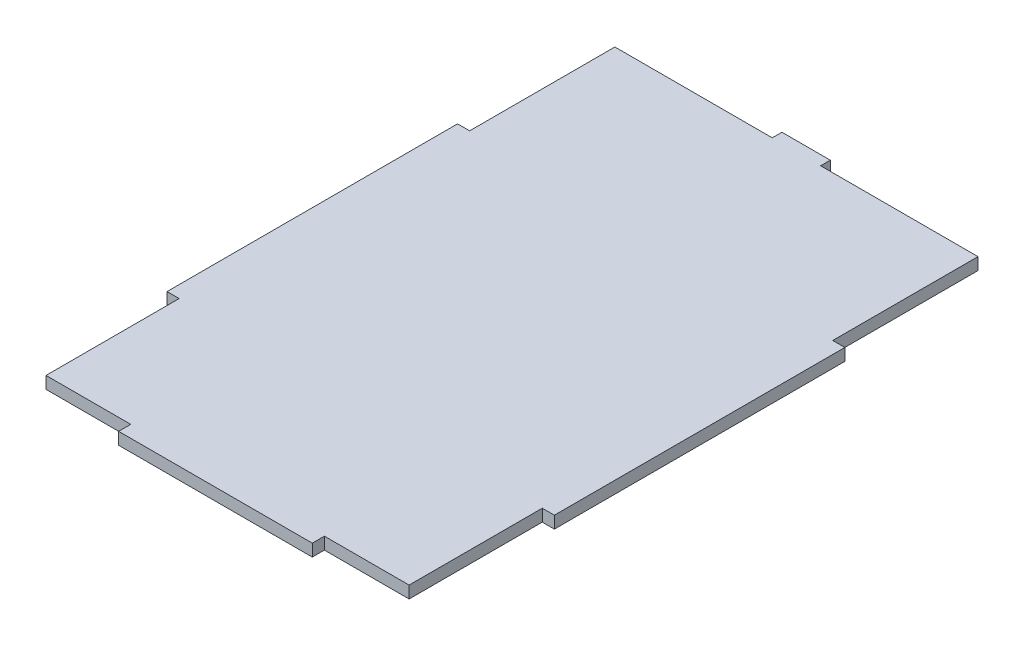
ISO-10303-21;
HEADER;
FILE_DESCRIPTION(('STEP AP214'),'2;1');
FILE_NAME('part.step','',(''),(''),'','','');
FILE_SCHEMA(('AUTOMOTIVE_DESIGN { 1 0 10303 214 1 1 1 1 }'));
ENDSEC;
DATA;
#1=APPLICATION_CONTEXT('core data for automotive mechanical design processes');
#2=APPLICATION_PROTOCOL_DEFINITION('international standard','automotive_design',2000,#1);
#3=PRODUCT_CONTEXT('',#1,'mechanical');
#4=PRODUCT('Part','Part','',(#3));
#5=PRODUCT_RELATED_PRODUCT_CATEGORY('part','',(#4));
#6=PRODUCT_DEFINITION_FORMATION('','',#4);
#7=PRODUCT_DEFINITION_CONTEXT('part definition',#1,'design');
#8=PRODUCT_DEFINITION('design','',#6,#7);
#9=PRODUCT_DEFINITION_SHAPE('','',#8);
#10=(LENGTH_UNIT() NAMED_UNIT(*) SI_UNIT(.MILLI.,.METRE.));
#11=(NAMED_UNIT(*) PLANE_ANGLE_UNIT() SI_UNIT($,.RADIAN.));
#12=(NAMED_UNIT(*) SI_UNIT($,.STERADIAN.) SOLID_ANGLE_UNIT());
#13=UNCERTAINTY_MEASURE_WITH_UNIT(LENGTH_MEASURE(1.E-05),#10,'distance_accuracy_value','');
#14=(GEOMETRIC_REPRESENTATION_CONTEXT(3) GLOBAL_UNCERTAINTY_ASSIGNED_CONTEXT((#13)) GLOBAL_UNIT_ASSIGNED_CONTEXT((#10,
#11,#12)) REPRESENTATION_CONTEXT('',''));
#15=CARTESIAN_POINT('',(0.,0.,0.));
#16=DIRECTION('',(0.,0.,1.));
#17=DIRECTION('',(1.,0.,0.));
#18=AXIS2_PLACEMENT_3D('',#15,#16,#17);
#19=CARTESIAN_POINT('',(-30.9107231920199,6.35,-193.318703241895));
#20=DIRECTION('',(0.,0.,1.));
#21=DIRECTION('',(1.,0.,0.));
#22=AXIS2_PLACEMENT_3D('',#19,#20,#21);
#23=PLANE('',#22);
#24=DIRECTION('',(0.,1.,0.));
#25=VECTOR('',#24,1.);
#26=CARTESIAN_POINT('',(57.9892768079801,0.,-193.318703241895));
#27=LINE('',#26,#25);
#28=CARTESIAN_POINT('',(57.9892768079801,0.,-193.318703241895));
#29=VERTEX_POINT('',#28);
#30=CARTESIAN_POINT('',(57.9892768079801,6.35,-193.318703241895));
#31=VERTEX_POINT('',#30);
#32=EDGE_CURVE('E280',#29,#31,#27,.T.);
#33=ORIENTED_EDGE('',*,*,#32,.F.);
#34=DIRECTION('',(-1.,0.,0.));
#35=VECTOR('',#34,1.);
#36=CARTESIAN_POINT('',(-30.9107231920199,0.,-193.318703241895));
#37=LINE('',#36,#35);
#38=CARTESIAN_POINT('',(-24.5607231920199,0.,-193.318703241895));
#39=VERTEX_POINT('',#38);
#40=EDGE_CURVE('E200',#29,#39,#37,.T.);
#41=ORIENTED_EDGE('',*,*,#40,.T.);
#42=DIRECTION('',(0.,1.,0.));
#43=VECTOR('',#42,1.);
#44=CARTESIAN_POINT('',(-24.5607231920199,0.,-193.318703241895));
#45=LINE('',#44,#43);
#46=CARTESIAN_POINT('',(-24.5607231920199,6.35,-193.318703241895));
#47=VERTEX_POINT('',#46);
#48=EDGE_CURVE('E223',#39,#47,#45,.T.);
#49=ORIENTED_EDGE('',*,*,#48,.T.);
#50=DIRECTION('',(-1.,0.,0.));
#51=VECTOR('',#50,1.);
#52=CARTESIAN_POINT('',(-30.9107231920199,6.35,-193.318703241895));
#53=LINE('',#52,#51);
#54=EDGE_CURVE('E41',#31,#47,#53,.T.);
#55=ORIENTED_EDGE('',*,*,#54,.F.);
#56=EDGE_LOOP('',(#33,#41,#49,#55));
#57=FACE_BOUND('',#56,.T.);
#58=ADVANCED_FACE('F32',(#57),#23,.F.);
#59=CARTESIAN_POINT('',(-30.9107231920199,6.35,111.481296758105));
#60=DIRECTION('',(1.,0.,0.));
#61=DIRECTION('',(0.,0.,-1.));
#62=AXIS2_PLACEMENT_3D('',#59,#60,#61);
#63=PLANE('',#62);
#64=DIRECTION('',(0.,0.,1.));
#65=VECTOR('',#64,1.);
#66=CARTESIAN_POINT('',(-30.9107231920199,6.35,111.481296758105));
#67=LINE('',#66,#65);
#68=CARTESIAN_POINT('',(-30.9107231920199,6.35,-117.118703241895));
#69=VERTEX_POINT('',#68);
#70=CARTESIAN_POINT('',(-30.9107231920199,6.35,35.2812967581047));
#71=VERTEX_POINT('',#70);
#72=EDGE_CURVE('E209',#69,#71,#67,.T.);
#73=ORIENTED_EDGE('',*,*,#72,.F.);
#74=DIRECTION('',(0.,1.,0.));
#75=VECTOR('',#74,1.);
#76=CARTESIAN_POINT('',(-30.9107231920199,0.,-117.118703241895));
#77=LINE('',#76,#75);
#78=CARTESIAN_POINT('',(-30.9107231920199,0.,-117.118703241895));
#79=VERTEX_POINT('',#78);
#80=EDGE_CURVE('E263',#79,#69,#77,.T.);
#81=ORIENTED_EDGE('',*,*,#80,.F.);
#82=DIRECTION('',(0.,0.,1.));
#83=VECTOR('',#82,1.);
#84=CARTESIAN_POINT('',(-30.9107231920199,0.,111.481296758105));
#85=LINE('',#84,#83);
#86=CARTESIAN_POINT('',(-30.9107231920199,0.,35.2812967581047));
#87=VERTEX_POINT('',#86);
#88=EDGE_CURVE('E197',#79,#87,#85,.T.);
#89=ORIENTED_EDGE('',*,*,#88,.T.);
#90=DIRECTION('',(0.,1.,0.));
#91=VECTOR('',#90,1.);
#92=CARTESIAN_POINT('',(-30.9107231920199,0.,35.2812967581047));
#93=LINE('',#92,#91);
#94=EDGE_CURVE('E202',#87,#71,#93,.T.);
#95=ORIENTED_EDGE('',*,*,#94,.T.);
#96=EDGE_LOOP('',(#73,#81,#89,#95));
#97=FACE_BOUND('',#96,.T.);
#98=ADVANCED_FACE('F34',(#97),#63,.F.);
#99=CARTESIAN_POINT('',(-30.9107231920199,6.35,111.481296758105));
#100=DIRECTION('',(0.,0.,-1.));
#101=DIRECTION('',(-1.,0.,0.));
#102=AXIS2_PLACEMENT_3D('',#99,#100,#101);
#103=PLANE('',#102);
#104=DIRECTION('',(1.,0.,0.));
#105=VECTOR('',#104,1.);
#106=CARTESIAN_POINT('',(-30.9107231920199,6.35,111.481296758105));
#107=LINE('',#106,#105);
#108=CARTESIAN_POINT('',(19.8892768079801,6.35,111.481296758105));
#109=VERTEX_POINT('',#108);
#110=CARTESIAN_POINT('',(121.48927680798,6.35,111.481296758105));
#111=VERTEX_POINT('',#110);
#112=EDGE_CURVE('E190',#109,#111,#107,.T.);
#113=ORIENTED_EDGE('',*,*,#112,.F.);
#114=DIRECTION('',(0.,1.,0.));
#115=VECTOR('',#114,1.);
#116=CARTESIAN_POINT('',(19.8892768079801,0.,111.481296758105));
#117=LINE('',#116,#115);
#118=CARTESIAN_POINT('',(19.8892768079801,0.,111.481296758105));
#119=VERTEX_POINT('',#118);
#120=EDGE_CURVE('E174',#119,#109,#117,.T.);
#121=ORIENTED_EDGE('',*,*,#120,.F.);
#122=DIRECTION('',(1.,0.,0.));
#123=VECTOR('',#122,1.);
#124=CARTESIAN_POINT('',(-30.9107231920199,0.,111.481296758105));
#125=LINE('',#124,#123);
#126=CARTESIAN_POINT('',(121.48927680798,0.,111.481296758105));
#127=VERTEX_POINT('',#126);
#128=EDGE_CURVE('E188',#119,#127,#125,.T.);
#129=ORIENTED_EDGE('',*,*,#128,.T.);
#130=DIRECTION('',(0.,1.,0.));
#131=VECTOR('',#130,1.);
#132=CARTESIAN_POINT('',(121.48927680798,0.,111.481296758105));
#133=LINE('',#132,#131);
#134=EDGE_CURVE('E310',#127,#111,#133,.T.);
#135=ORIENTED_EDGE('',*,*,#134,.T.);
#136=EDGE_LOOP('',(#113,#121,#129,#135));
#137=FACE_BOUND('',#136,.T.);
#138=ADVANCED_FACE('F186',(#137),#103,.F.);
#139=CARTESIAN_POINT('',(172.28927680798,6.35,111.481296758105));
#140=DIRECTION('',(-1.,0.,0.));
#141=DIRECTION('',(0.,0.,1.));
#142=AXIS2_PLACEMENT_3D('',#139,#140,#141);
#143=PLANE('',#142);
#144=DIRECTION('',(0.,0.,-1.));
#145=VECTOR('',#144,1.);
#146=CARTESIAN_POINT('',(172.28927680798,6.35,111.481296758105));
#147=LINE('',#146,#145);
#148=CARTESIAN_POINT('',(172.28927680798,6.35,35.2812967581047));
#149=VERTEX_POINT('',#148);
#150=CARTESIAN_POINT('',(172.28927680798,6.35,-117.118703241895));
#151=VERTEX_POINT('',#150);
#152=EDGE_CURVE('E205',#149,#151,#147,.T.);
#153=ORIENTED_EDGE('',*,*,#152,.F.);
#154=DIRECTION('',(0.,1.,0.));
#155=VECTOR('',#154,1.);
#156=CARTESIAN_POINT('',(172.28927680798,0.,35.2812967581047));
#157=LINE('',#156,#155);
#158=CARTESIAN_POINT('',(172.28927680798,0.,35.2812967581047));
#159=VERTEX_POINT('',#158);
#160=EDGE_CURVE('E227',#159,#149,#157,.T.);
#161=ORIENTED_EDGE('',*,*,#160,.F.);
#162=DIRECTION('',(0.,0.,-1.));
#163=VECTOR('',#162,1.);
#164=CARTESIAN_POINT('',(172.28927680798,0.,111.481296758105));
#165=LINE('',#164,#163);
#166=CARTESIAN_POINT('',(172.28927680798,0.,-117.118703241895));
#167=VERTEX_POINT('',#166);
#168=EDGE_CURVE('E196',#159,#167,#165,.T.);
#169=ORIENTED_EDGE('',*,*,#168,.T.);
#170=DIRECTION('',(0.,1.,0.));
#171=VECTOR('',#170,1.);
#172=CARTESIAN_POINT('',(172.28927680798,0.,-117.118703241895));
#173=LINE('',#172,#171);
#174=EDGE_CURVE('E250',#167,#151,#173,.T.);
#175=ORIENTED_EDGE('',*,*,#174,.T.);
#176=EDGE_LOOP('',(#153,#161,#169,#175));
#177=FACE_BOUND('',#176,.T.);
#178=ADVANCED_FACE('F390',(#177),#143,.F.);
#179=CARTESIAN_POINT('',(165.93927680798,0.,-193.318703241895));
#180=VERTEX_POINT('',#179);
#181=CARTESIAN_POINT('',(83.3892768079801,0.,-193.318703241895));
#182=VERTEX_POINT('',#181);
#183=EDGE_CURVE('E36',#180,#182,#37,.T.);
#184=ORIENTED_EDGE('',*,*,#183,.T.);
#185=DIRECTION('',(0.,1.,0.));
#186=VECTOR('',#185,1.);
#187=CARTESIAN_POINT('',(83.3892768079801,0.,-193.318703241895));
#188=LINE('',#187,#186);
#189=CARTESIAN_POINT('',(83.3892768079801,6.35,-193.318703241895));
#190=VERTEX_POINT('',#189);
#191=EDGE_CURVE('E282',#182,#190,#188,.T.);
#192=ORIENTED_EDGE('',*,*,#191,.T.);
#193=CARTESIAN_POINT('',(165.93927680798,6.35,-193.318703241895));
#194=VERTEX_POINT('',#193);
#195=EDGE_CURVE('E11',#194,#190,#53,.T.);
#196=ORIENTED_EDGE('',*,*,#195,.F.);
#197=DIRECTION('',(0.,1.,0.));
#198=VECTOR('',#197,1.);
#199=CARTESIAN_POINT('',(165.93927680798,0.,-193.318703241895));
#200=LINE('',#199,#198);
#201=EDGE_CURVE('E245',#180,#194,#200,.T.);
#202=ORIENTED_EDGE('',*,*,#201,.F.);
#203=EDGE_LOOP('',(#184,#192,#196,#202));
#204=FACE_BOUND('',#203,.T.);
#205=ADVANCED_FACE('F356',(#204),#23,.F.);
#206=CARTESIAN_POINT('',(0.,6.35,0.));
#207=DIRECTION('',(0.,-1.,0.));
#208=DIRECTION('',(0.,0.,-1.));
#209=AXIS2_PLACEMENT_3D('',#206,#207,#208);
#210=PLANE('',#209);
#211=DIRECTION('',(0.,0.,-1.));
#212=VECTOR('',#211,1.);
#213=CARTESIAN_POINT('',(-24.5607231920199,6.35,111.481296758105));
#214=LINE('',#213,#212);
#215=CARTESIAN_POINT('',(-24.5607231920199,6.35,105.131296758105));
#216=VERTEX_POINT('',#215);
#217=CARTESIAN_POINT('',(-24.5607231920199,6.35,35.2812967581047));
#218=VERTEX_POINT('',#217);
#219=EDGE_CURVE('E221',#216,#218,#214,.T.);
#220=ORIENTED_EDGE('',*,*,#219,.F.);
#221=DIRECTION('',(-1.,0.,0.));
#222=VECTOR('',#221,1.);
#223=CARTESIAN_POINT('',(-24.5607231920199,6.35,105.131296758105));
#224=LINE('',#223,#222);
#225=CARTESIAN_POINT('',(19.8892768079801,6.35,105.131296758105));
#226=VERTEX_POINT('',#225);
#227=EDGE_CURVE('E49',#226,#216,#224,.T.);
#228=ORIENTED_EDGE('',*,*,#227,.F.);
#229=DIRECTION('',(0.,0.,-1.));
#230=VECTOR('',#229,1.);
#231=CARTESIAN_POINT('',(19.8892768079801,6.35,111.481296758105));
#232=LINE('',#231,#230);
#233=EDGE_CURVE('E312',#109,#226,#232,.T.);
#234=ORIENTED_EDGE('',*,*,#233,.F.);
#235=ORIENTED_EDGE('',*,*,#112,.T.);
#236=DIRECTION('',(0.,0.,1.));
#237=VECTOR('',#236,1.);
#238=CARTESIAN_POINT('',(121.48927680798,6.35,111.481296758105));
#239=LINE('',#238,#237);
#240=CARTESIAN_POINT('',(121.48927680798,6.35,105.131296758105));
#241=VERTEX_POINT('',#240);
#242=EDGE_CURVE('E313',#241,#111,#239,.T.);
#243=ORIENTED_EDGE('',*,*,#242,.F.);
#244=DIRECTION('',(-1.,0.,0.));
#245=VECTOR('',#244,1.);
#246=CARTESIAN_POINT('',(165.93927680798,6.35,105.131296758105));
#247=LINE('',#246,#245);
#248=CARTESIAN_POINT('',(165.93927680798,6.35,105.131296758105));
#249=VERTEX_POINT('',#248);
#250=EDGE_CURVE('E315',#249,#241,#247,.T.);
#251=ORIENTED_EDGE('',*,*,#250,.F.);
#252=DIRECTION('',(0.,0.,1.));
#253=VECTOR('',#252,1.);
#254=CARTESIAN_POINT('',(165.93927680798,6.35,111.481296758105));
#255=LINE('',#254,#253);
#256=CARTESIAN_POINT('',(165.93927680798,6.35,35.2812967581047));
#257=VERTEX_POINT('',#256);
#258=EDGE_CURVE('E233',#257,#249,#255,.T.);
#259=ORIENTED_EDGE('',*,*,#258,.F.);
#260=DIRECTION('',(-1.,0.,0.));
#261=VECTOR('',#260,1.);
#262=CARTESIAN_POINT('',(172.28927680798,6.35,35.2812967581047));
#263=LINE('',#262,#261);
#264=EDGE_CURVE('E237',#149,#257,#263,.T.);
#265=ORIENTED_EDGE('',*,*,#264,.F.);
#266=ORIENTED_EDGE('',*,*,#152,.T.);
#267=DIRECTION('',(1.,0.,0.));
#268=VECTOR('',#267,1.);
#269=CARTESIAN_POINT('',(172.28927680798,6.35,-117.118703241895));
#270=LINE('',#269,#268);
#271=CARTESIAN_POINT('',(165.93927680798,6.35,-117.118703241895));
#272=VERTEX_POINT('',#271);
#273=EDGE_CURVE('E254',#272,#151,#270,.T.);
#274=ORIENTED_EDGE('',*,*,#273,.F.);
#275=DIRECTION('',(0.,0.,1.));
#276=VECTOR('',#275,1.);
#277=CARTESIAN_POINT('',(165.93927680798,6.35,-193.318703241895));
#278=LINE('',#277,#276);
#279=EDGE_CURVE('E232',#194,#272,#278,.T.);
#280=ORIENTED_EDGE('',*,*,#279,.F.);
#281=ORIENTED_EDGE('',*,*,#195,.T.);
#282=DIRECTION('',(0.,0.,-1.));
#283=VECTOR('',#282,1.);
#284=CARTESIAN_POINT('',(83.3892768079801,6.35,-193.318703241895));
#285=LINE('',#284,#283);
#286=CARTESIAN_POINT('',(83.3892768079801,6.35,-198.398703241895));
#287=VERTEX_POINT('',#286);
#288=EDGE_CURVE('E293',#190,#287,#285,.T.);
#289=ORIENTED_EDGE('',*,*,#288,.T.);
#290=DIRECTION('',(-1.,0.,0.));
#291=VECTOR('',#290,1.);
#292=CARTESIAN_POINT('',(57.9892768079801,6.35,-198.398703241895));
#293=LINE('',#292,#291);
#294=CARTESIAN_POINT('',(57.9892768079801,6.35,-198.398703241895));
#295=VERTEX_POINT('',#294);
#296=EDGE_CURVE('E289',#287,#295,#293,.T.);
#297=ORIENTED_EDGE('',*,*,#296,.T.);
#298=DIRECTION('',(0.,0.,1.));
#299=VECTOR('',#298,1.);
#300=CARTESIAN_POINT('',(57.9892768079801,6.35,-193.318703241895));
#301=LINE('',#300,#299);
#302=EDGE_CURVE('E296',#295,#31,#301,.T.);
#303=ORIENTED_EDGE('',*,*,#302,.T.);
#304=ORIENTED_EDGE('',*,*,#54,.T.);
#305=DIRECTION('',(0.,0.,-1.));
#306=VECTOR('',#305,1.);
#307=CARTESIAN_POINT('',(-24.5607231920199,6.35,-193.318703241895));
#308=LINE('',#307,#306);
#309=CARTESIAN_POINT('',(-24.5607231920199,6.35,-117.118703241895));
#310=VERTEX_POINT('',#309);
#311=EDGE_CURVE('E270',#310,#47,#308,.T.);
#312=ORIENTED_EDGE('',*,*,#311,.F.);
#313=DIRECTION('',(1.,0.,0.));
#314=VECTOR('',#313,1.);
#315=CARTESIAN_POINT('',(-30.9107231920199,6.35,-117.118703241895));
#316=LINE('',#315,#314);
#317=EDGE_CURVE('E253',#69,#310,#316,.T.);
#318=ORIENTED_EDGE('',*,*,#317,.F.);
#319=ORIENTED_EDGE('',*,*,#72,.T.);
#320=DIRECTION('',(-1.,0.,0.));
#321=VECTOR('',#320,1.);
#322=CARTESIAN_POINT('',(-30.9107231920199,6.35,35.2812967581047));
#323=LINE('',#322,#321);
#324=EDGE_CURVE('E218',#218,#71,#323,.T.);
#325=ORIENTED_EDGE('',*,*,#324,.F.);
#326=EDGE_LOOP('',(#220,#228,#234,#235,#243,#251,#259,#265,#266,#274,#280,#281,#289,#297,#303,
#304,#312,#318,#319,#325));
#327=FACE_BOUND('',#326,.T.);
#328=ADVANCED_FACE('F334',(#327),#210,.F.);
#329=CARTESIAN_POINT('',(0.,0.,0.));
#330=DIRECTION('',(0.,-1.,0.));
#331=DIRECTION('',(0.,0.,-1.));
#332=AXIS2_PLACEMENT_3D('',#329,#330,#331);
#333=PLANE('',#332);
#334=DIRECTION('',(-1.,0.,0.));
#335=VECTOR('',#334,1.);
#336=CARTESIAN_POINT('',(-24.5607231920199,0.,105.131296758105));
#337=LINE('',#336,#335);
#338=CARTESIAN_POINT('',(19.8892768079801,0.,105.131296758105));
#339=VERTEX_POINT('',#338);
#340=CARTESIAN_POINT('',(-24.5607231920199,0.,105.131296758105));
#341=VERTEX_POINT('',#340);
#342=EDGE_CURVE('E181',#339,#341,#337,.T.);
#343=ORIENTED_EDGE('',*,*,#342,.T.);
#344=DIRECTION('',(0.,0.,-1.));
#345=VECTOR('',#344,1.);
#346=CARTESIAN_POINT('',(-24.5607231920199,0.,111.481296758105));
#347=LINE('',#346,#345);
#348=CARTESIAN_POINT('',(-24.5607231920199,0.,35.2812967581047));
#349=VERTEX_POINT('',#348);
#350=EDGE_CURVE('E220',#341,#349,#347,.T.);
#351=ORIENTED_EDGE('',*,*,#350,.T.);
#352=DIRECTION('',(-1.,0.,0.));
#353=VECTOR('',#352,1.);
#354=CARTESIAN_POINT('',(-30.9107231920199,0.,35.2812967581047));
#355=LINE('',#354,#353);
#356=EDGE_CURVE('E215',#349,#87,#355,.T.);
#357=ORIENTED_EDGE('',*,*,#356,.T.);
#358=ORIENTED_EDGE('',*,*,#88,.F.);
#359=DIRECTION('',(1.,0.,0.));
#360=VECTOR('',#359,1.);
#361=CARTESIAN_POINT('',(-30.9107231920199,0.,-117.118703241895));
#362=LINE('',#361,#360);
#363=CARTESIAN_POINT('',(-24.5607231920199,0.,-117.118703241895));
#364=VERTEX_POINT('',#363);
#365=EDGE_CURVE('E273',#79,#364,#362,.T.);
#366=ORIENTED_EDGE('',*,*,#365,.T.);
#367=DIRECTION('',(0.,0.,-1.));
#368=VECTOR('',#367,1.);
#369=CARTESIAN_POINT('',(-24.5607231920199,0.,-193.318703241895));
#370=LINE('',#369,#368);
#371=EDGE_CURVE('E266',#364,#39,#370,.T.);
#372=ORIENTED_EDGE('',*,*,#371,.T.);
#373=ORIENTED_EDGE('',*,*,#40,.F.);
#374=DIRECTION('',(0.,0.,1.));
#375=VECTOR('',#374,1.);
#376=CARTESIAN_POINT('',(57.9892768079801,0.,-193.318703241895));
#377=LINE('',#376,#375);
#378=CARTESIAN_POINT('',(57.9892768079801,0.,-198.398703241895));
#379=VERTEX_POINT('',#378);
#380=EDGE_CURVE('E292',#379,#29,#377,.T.);
#381=ORIENTED_EDGE('',*,*,#380,.F.);
#382=DIRECTION('',(-1.,0.,0.));
#383=VECTOR('',#382,1.);
#384=CARTESIAN_POINT('',(57.9892768079801,0.,-198.398703241895));
#385=LINE('',#384,#383);
#386=CARTESIAN_POINT('',(83.3892768079801,0.,-198.398703241895));
#387=VERTEX_POINT('',#386);
#388=EDGE_CURVE('E283',#387,#379,#385,.T.);
#389=ORIENTED_EDGE('',*,*,#388,.F.);
#390=DIRECTION('',(0.,0.,-1.));
#391=VECTOR('',#390,1.);
#392=CARTESIAN_POINT('',(83.3892768079801,0.,-193.318703241895));
#393=LINE('',#392,#391);
#394=EDGE_CURVE('E302',#182,#387,#393,.T.);
#395=ORIENTED_EDGE('',*,*,#394,.F.);
#396=ORIENTED_EDGE('',*,*,#183,.F.);
#397=DIRECTION('',(0.,0.,1.));
#398=VECTOR('',#397,1.);
#399=CARTESIAN_POINT('',(165.93927680798,0.,-193.318703241895));
#400=LINE('',#399,#398);
#401=CARTESIAN_POINT('',(165.93927680798,0.,-117.118703241895));
#402=VERTEX_POINT('',#401);
#403=EDGE_CURVE('E256',#180,#402,#400,.T.);
#404=ORIENTED_EDGE('',*,*,#403,.T.);
#405=DIRECTION('',(1.,0.,0.));
#406=VECTOR('',#405,1.);
#407=CARTESIAN_POINT('',(172.28927680798,0.,-117.118703241895));
#408=LINE('',#407,#406);
#409=EDGE_CURVE('E248',#402,#167,#408,.T.);
#410=ORIENTED_EDGE('',*,*,#409,.T.);
#411=ORIENTED_EDGE('',*,*,#168,.F.);
#412=DIRECTION('',(-1.,0.,0.));
#413=VECTOR('',#412,1.);
#414=CARTESIAN_POINT('',(172.28927680798,0.,35.2812967581047));
#415=LINE('',#414,#413);
#416=CARTESIAN_POINT('',(165.93927680798,0.,35.2812967581047));
#417=VERTEX_POINT('',#416);
#418=EDGE_CURVE('E236',#159,#417,#415,.T.);
#419=ORIENTED_EDGE('',*,*,#418,.T.);
#420=DIRECTION('',(0.,0.,1.));
#421=VECTOR('',#420,1.);
#422=CARTESIAN_POINT('',(165.93927680798,0.,111.481296758105));
#423=LINE('',#422,#421);
#424=CARTESIAN_POINT('',(165.93927680798,0.,105.131296758105));
#425=VERTEX_POINT('',#424);
#426=EDGE_CURVE('E230',#417,#425,#423,.T.);
#427=ORIENTED_EDGE('',*,*,#426,.T.);
#428=DIRECTION('',(-1.,0.,0.));
#429=VECTOR('',#428,1.);
#430=CARTESIAN_POINT('',(165.93927680798,0.,105.131296758105));
#431=LINE('',#430,#429);
#432=CARTESIAN_POINT('',(121.48927680798,0.,105.131296758105));
#433=VERTEX_POINT('',#432);
#434=EDGE_CURVE('E57',#425,#433,#431,.T.);
#435=ORIENTED_EDGE('',*,*,#434,.T.);
#436=DIRECTION('',(0.,0.,1.));
#437=VECTOR('',#436,1.);
#438=CARTESIAN_POINT('',(121.48927680798,0.,111.481296758105));
#439=LINE('',#438,#437);
#440=EDGE_CURVE('E195',#433,#127,#439,.T.);
#441=ORIENTED_EDGE('',*,*,#440,.T.);
#442=ORIENTED_EDGE('',*,*,#128,.F.);
#443=DIRECTION('',(0.,0.,-1.));
#444=VECTOR('',#443,1.);
#445=CARTESIAN_POINT('',(19.8892768079801,0.,111.481296758105));
#446=LINE('',#445,#444);
#447=EDGE_CURVE('E170',#119,#339,#446,.T.);
#448=ORIENTED_EDGE('',*,*,#447,.T.);
#449=EDGE_LOOP('',(#343,#351,#357,#358,#366,#372,#373,#381,#389,#395,#396,#404,#410,#411,#419,
#427,#435,#441,#442,#448));
#450=FACE_BOUND('',#449,.T.);
#451=ADVANCED_FACE('F193',(#450),#333,.T.);
#452=CARTESIAN_POINT('',(-30.9107231920199,0.,35.2812967581047));
#453=DIRECTION('',(0.,0.,-1.));
#454=DIRECTION('',(-1.,0.,0.));
#455=AXIS2_PLACEMENT_3D('',#452,#453,#454);
#456=PLANE('',#455);
#457=ORIENTED_EDGE('',*,*,#324,.T.);
#458=ORIENTED_EDGE('',*,*,#94,.F.);
#459=ORIENTED_EDGE('',*,*,#356,.F.);
#460=DIRECTION('',(0.,1.,0.));
#461=VECTOR('',#460,1.);
#462=CARTESIAN_POINT('',(-24.5607231920199,0.,35.2812967581047));
#463=LINE('',#462,#461);
#464=EDGE_CURVE('E212',#349,#218,#463,.T.);
#465=ORIENTED_EDGE('',*,*,#464,.T.);
#466=EDGE_LOOP('',(#457,#458,#459,#465));
#467=FACE_BOUND('',#466,.T.);
#468=ADVANCED_FACE('F332',(#467),#456,.F.);
#469=CARTESIAN_POINT('',(-24.5607231920199,0.,111.481296758105));
#470=DIRECTION('',(1.,0.,0.));
#471=DIRECTION('',(0.,0.,-1.));
#472=AXIS2_PLACEMENT_3D('',#469,#470,#471);
#473=PLANE('',#472);
#474=ORIENTED_EDGE('',*,*,#350,.F.);
#475=DIRECTION('',(0.,1.,0.));
#476=VECTOR('',#475,1.);
#477=CARTESIAN_POINT('',(-24.5607231920199,0.,105.131296758105));
#478=LINE('',#477,#476);
#479=EDGE_CURVE('E299',#341,#216,#478,.T.);
#480=ORIENTED_EDGE('',*,*,#479,.T.);
#481=ORIENTED_EDGE('',*,*,#219,.T.);
#482=ORIENTED_EDGE('',*,*,#464,.F.);
#483=EDGE_LOOP('',(#474,#480,#481,#482));
#484=FACE_BOUND('',#483,.T.);
#485=ADVANCED_FACE('F328',(#484),#473,.F.);
#486=CARTESIAN_POINT('',(-24.5607231920199,0.,-193.318703241895));
#487=DIRECTION('',(1.,0.,0.));
#488=DIRECTION('',(0.,0.,-1.));
#489=AXIS2_PLACEMENT_3D('',#486,#487,#488);
#490=PLANE('',#489);
#491=ORIENTED_EDGE('',*,*,#311,.T.);
#492=ORIENTED_EDGE('',*,*,#48,.F.);
#493=ORIENTED_EDGE('',*,*,#371,.F.);
#494=DIRECTION('',(0.,1.,0.));
#495=VECTOR('',#494,1.);
#496=CARTESIAN_POINT('',(-24.5607231920199,0.,-117.118703241895));
#497=LINE('',#496,#495);
#498=EDGE_CURVE('E265',#364,#310,#497,.T.);
#499=ORIENTED_EDGE('',*,*,#498,.T.);
#500=EDGE_LOOP('',(#491,#492,#493,#499));
#501=FACE_BOUND('',#500,.T.);
#502=ADVANCED_FACE('F346',(#501),#490,.F.);
#503=CARTESIAN_POINT('',(-30.9107231920199,0.,-117.118703241895));
#504=DIRECTION('',(0.,0.,1.));
#505=DIRECTION('',(1.,0.,0.));
#506=AXIS2_PLACEMENT_3D('',#503,#504,#505);
#507=PLANE('',#506);
#508=ORIENTED_EDGE('',*,*,#317,.T.);
#509=ORIENTED_EDGE('',*,*,#498,.F.);
#510=ORIENTED_EDGE('',*,*,#365,.F.);
#511=ORIENTED_EDGE('',*,*,#80,.T.);
#512=EDGE_LOOP('',(#508,#509,#510,#511));
#513=FACE_BOUND('',#512,.T.);
#514=ADVANCED_FACE('F344',(#513),#507,.F.);
#515=CARTESIAN_POINT('',(172.28927680798,0.,-117.118703241895));
#516=DIRECTION('',(0.,0.,1.));
#517=DIRECTION('',(1.,0.,0.));
#518=AXIS2_PLACEMENT_3D('',#515,#516,#517);
#519=PLANE('',#518);
#520=ORIENTED_EDGE('',*,*,#273,.T.);
#521=ORIENTED_EDGE('',*,*,#174,.F.);
#522=ORIENTED_EDGE('',*,*,#409,.F.);
#523=DIRECTION('',(0.,1.,0.));
#524=VECTOR('',#523,1.);
#525=CARTESIAN_POINT('',(165.93927680798,0.,-117.118703241895));
#526=LINE('',#525,#524);
#527=EDGE_CURVE('E247',#402,#272,#526,.T.);
#528=ORIENTED_EDGE('',*,*,#527,.T.);
#529=EDGE_LOOP('',(#520,#521,#522,#528));
#530=FACE_BOUND('',#529,.T.);
#531=ADVANCED_FACE('F410',(#530),#519,.F.);
#532=CARTESIAN_POINT('',(165.93927680798,0.,-193.318703241895));
#533=DIRECTION('',(-1.,0.,0.));
#534=DIRECTION('',(0.,0.,1.));
#535=AXIS2_PLACEMENT_3D('',#532,#533,#534);
#536=PLANE('',#535);
#537=ORIENTED_EDGE('',*,*,#279,.T.);
#538=ORIENTED_EDGE('',*,*,#527,.F.);
#539=ORIENTED_EDGE('',*,*,#403,.F.);
#540=ORIENTED_EDGE('',*,*,#201,.T.);
#541=EDGE_LOOP('',(#537,#538,#539,#540));
#542=FACE_BOUND('',#541,.T.);
#543=ADVANCED_FACE('F412',(#542),#536,.F.);
#544=CARTESIAN_POINT('',(165.93927680798,0.,111.481296758105));
#545=DIRECTION('',(-1.,0.,0.));
#546=DIRECTION('',(0.,0.,1.));
#547=AXIS2_PLACEMENT_3D('',#544,#545,#546);
#548=PLANE('',#547);
#549=ORIENTED_EDGE('',*,*,#258,.T.);
#550=DIRECTION('',(0.,1.,0.));
#551=VECTOR('',#550,1.);
#552=CARTESIAN_POINT('',(165.93927680798,0.,105.131296758105));
#553=LINE('',#552,#551);
#554=EDGE_CURVE('E306',#425,#249,#553,.T.);
#555=ORIENTED_EDGE('',*,*,#554,.F.);
#556=ORIENTED_EDGE('',*,*,#426,.F.);
#557=DIRECTION('',(0.,1.,0.));
#558=VECTOR('',#557,1.);
#559=CARTESIAN_POINT('',(165.93927680798,0.,35.2812967581047));
#560=LINE('',#559,#558);
#561=EDGE_CURVE('E229',#417,#257,#560,.T.);
#562=ORIENTED_EDGE('',*,*,#561,.T.);
#563=EDGE_LOOP('',(#549,#555,#556,#562));
#564=FACE_BOUND('',#563,.T.);
#565=ADVANCED_FACE('F377',(#564),#548,.F.);
#566=CARTESIAN_POINT('',(172.28927680798,0.,35.2812967581047));
#567=DIRECTION('',(0.,0.,-1.));
#568=DIRECTION('',(-1.,0.,0.));
#569=AXIS2_PLACEMENT_3D('',#566,#567,#568);
#570=PLANE('',#569);
#571=ORIENTED_EDGE('',*,*,#264,.T.);
#572=ORIENTED_EDGE('',*,*,#561,.F.);
#573=ORIENTED_EDGE('',*,*,#418,.F.);
#574=ORIENTED_EDGE('',*,*,#160,.T.);
#575=EDGE_LOOP('',(#571,#572,#573,#574));
#576=FACE_BOUND('',#575,.T.);
#577=ADVANCED_FACE('F370',(#576),#570,.F.);
#578=CARTESIAN_POINT('',(57.9892768079801,0.,-193.318703241895));
#579=DIRECTION('',(-1.,0.,0.));
#580=DIRECTION('',(0.,0.,1.));
#581=AXIS2_PLACEMENT_3D('',#578,#579,#580);
#582=PLANE('',#581);
#583=ORIENTED_EDGE('',*,*,#302,.F.);
#584=DIRECTION('',(0.,1.,0.));
#585=VECTOR('',#584,1.);
#586=CARTESIAN_POINT('',(57.9892768079801,0.,-198.398703241895));
#587=LINE('',#586,#585);
#588=EDGE_CURVE('E240',#379,#295,#587,.T.);
#589=ORIENTED_EDGE('',*,*,#588,.F.);
#590=ORIENTED_EDGE('',*,*,#380,.T.);
#591=ORIENTED_EDGE('',*,*,#32,.T.);
#592=EDGE_LOOP('',(#583,#589,#590,#591));
#593=FACE_BOUND('',#592,.T.);
#594=ADVANCED_FACE('F368',(#593),#582,.T.);
#595=CARTESIAN_POINT('',(57.9892768079801,0.,-198.398703241895));
#596=DIRECTION('',(0.,0.,-1.));
#597=DIRECTION('',(-1.,0.,0.));
#598=AXIS2_PLACEMENT_3D('',#595,#596,#597);
#599=PLANE('',#598);
#600=ORIENTED_EDGE('',*,*,#296,.F.);
#601=DIRECTION('',(0.,1.,0.));
#602=VECTOR('',#601,1.);
#603=CARTESIAN_POINT('',(83.3892768079801,0.,-198.398703241895));
#604=LINE('',#603,#602);
#605=EDGE_CURVE('E286',#387,#287,#604,.T.);
#606=ORIENTED_EDGE('',*,*,#605,.F.);
#607=ORIENTED_EDGE('',*,*,#388,.T.);
#608=ORIENTED_EDGE('',*,*,#588,.T.);
#609=EDGE_LOOP('',(#600,#606,#607,#608));
#610=FACE_BOUND('',#609,.T.);
#611=ADVANCED_FACE('F365',(#610),#599,.T.);
#612=CARTESIAN_POINT('',(83.3892768079801,0.,-193.318703241895));
#613=DIRECTION('',(1.,0.,0.));
#614=DIRECTION('',(0.,0.,-1.));
#615=AXIS2_PLACEMENT_3D('',#612,#613,#614);
#616=PLANE('',#615);
#617=ORIENTED_EDGE('',*,*,#288,.F.);
#618=ORIENTED_EDGE('',*,*,#191,.F.);
#619=ORIENTED_EDGE('',*,*,#394,.T.);
#620=ORIENTED_EDGE('',*,*,#605,.T.);
#621=EDGE_LOOP('',(#617,#618,#619,#620));
#622=FACE_BOUND('',#621,.T.);
#623=ADVANCED_FACE('F361',(#622),#616,.T.);
#624=CARTESIAN_POINT('',(121.48927680798,0.,111.481296758105));
#625=DIRECTION('',(-1.,0.,0.));
#626=DIRECTION('',(0.,0.,1.));
#627=AXIS2_PLACEMENT_3D('',#624,#625,#626);
#628=PLANE('',#627);
#629=ORIENTED_EDGE('',*,*,#242,.T.);
#630=ORIENTED_EDGE('',*,*,#134,.F.);
#631=ORIENTED_EDGE('',*,*,#440,.F.);
#632=DIRECTION('',(0.,1.,0.));
#633=VECTOR('',#632,1.);
#634=CARTESIAN_POINT('',(121.48927680798,0.,105.131296758105));
#635=LINE('',#634,#633);
#636=EDGE_CURVE('E308',#433,#241,#635,.T.);
#637=ORIENTED_EDGE('',*,*,#636,.T.);
#638=EDGE_LOOP('',(#629,#630,#631,#637));
#639=FACE_BOUND('',#638,.T.);
#640=ADVANCED_FACE('F496',(#639),#628,.F.);
#641=CARTESIAN_POINT('',(165.93927680798,0.,105.131296758105));
#642=DIRECTION('',(0.,0.,-1.));
#643=DIRECTION('',(-1.,0.,0.));
#644=AXIS2_PLACEMENT_3D('',#641,#642,#643);
#645=PLANE('',#644);
#646=ORIENTED_EDGE('',*,*,#250,.T.);
#647=ORIENTED_EDGE('',*,*,#636,.F.);
#648=ORIENTED_EDGE('',*,*,#434,.F.);
#649=ORIENTED_EDGE('',*,*,#554,.T.);
#650=EDGE_LOOP('',(#646,#647,#648,#649));
#651=FACE_BOUND('',#650,.T.);
#652=ADVANCED_FACE('F537',(#651),#645,.F.);
#653=CARTESIAN_POINT('',(-24.5607231920199,0.,105.131296758105));
#654=DIRECTION('',(0.,0.,-1.));
#655=DIRECTION('',(-1.,0.,0.));
#656=AXIS2_PLACEMENT_3D('',#653,#654,#655);
#657=PLANE('',#656);
#658=ORIENTED_EDGE('',*,*,#227,.T.);
#659=ORIENTED_EDGE('',*,*,#479,.F.);
#660=ORIENTED_EDGE('',*,*,#342,.F.);
#661=DIRECTION('',(0.,1.,0.));
#662=VECTOR('',#661,1.);
#663=CARTESIAN_POINT('',(19.8892768079801,0.,105.131296758105));
#664=LINE('',#663,#662);
#665=EDGE_CURVE('E176',#339,#226,#664,.T.);
#666=ORIENTED_EDGE('',*,*,#665,.T.);
#667=EDGE_LOOP('',(#658,#659,#660,#666));
#668=FACE_BOUND('',#667,.T.);
#669=ADVANCED_FACE('F544',(#668),#657,.F.);
#670=CARTESIAN_POINT('',(19.8892768079801,0.,111.481296758105));
#671=DIRECTION('',(1.,0.,0.));
#672=DIRECTION('',(0.,0.,-1.));
#673=AXIS2_PLACEMENT_3D('',#670,#671,#672);
#674=PLANE('',#673);
#675=ORIENTED_EDGE('',*,*,#233,.T.);
#676=ORIENTED_EDGE('',*,*,#665,.F.);
#677=ORIENTED_EDGE('',*,*,#447,.F.);
#678=ORIENTED_EDGE('',*,*,#120,.T.);
#679=EDGE_LOOP('',(#675,#676,#677,#678));
#680=FACE_BOUND('',#679,.T.);
#681=ADVANCED_FACE('F173',(#680),#674,.F.);
#682=CLOSED_SHELL('',(#58,#98,#138,#178,#205,#328,#451,#468,#485,#502,#514,#531,#543,#565,#577,
#594,#611,#623,#640,#652,#669,#681));
#683=MANIFOLD_SOLID_BREP('B2',#682);
#684=ADVANCED_BREP_SHAPE_REPRESENTATION('',(#18,#683),#14);
#685=SHAPE_DEFINITION_REPRESENTATION(#9,#684);
ENDSEC;
END-ISO-10303-21;
